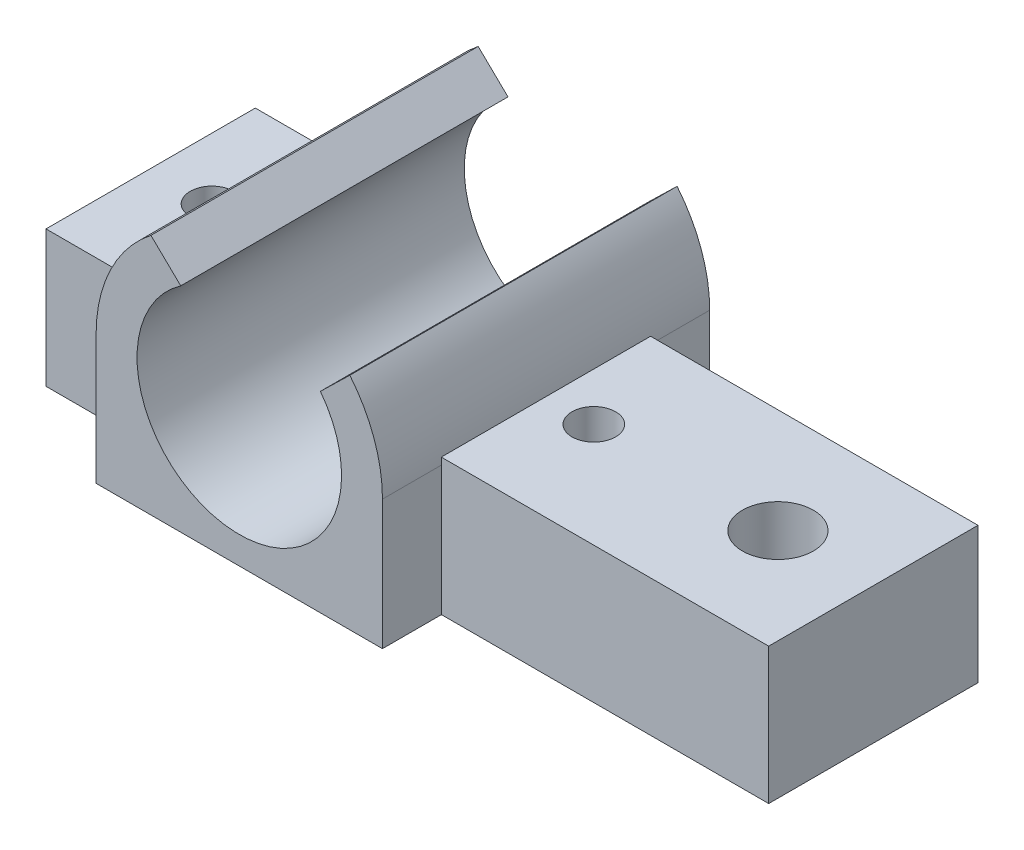
ISO-10303-21;
HEADER;
FILE_DESCRIPTION(('STEP AP214'),'2;1');
FILE_NAME('part.step','',(''),(''),'','','');
FILE_SCHEMA(('AUTOMOTIVE_DESIGN { 1 0 10303 214 1 1 1 1 }'));
ENDSEC;
DATA;
#1=APPLICATION_CONTEXT('core data for automotive mechanical design processes');
#2=APPLICATION_PROTOCOL_DEFINITION('international standard','automotive_design',2000,#1);
#3=PRODUCT_CONTEXT('',#1,'mechanical');
#4=PRODUCT('Part','Part','',(#3));
#5=PRODUCT_RELATED_PRODUCT_CATEGORY('part','',(#4));
#6=PRODUCT_DEFINITION_FORMATION('','',#4);
#7=PRODUCT_DEFINITION_CONTEXT('part definition',#1,'design');
#8=PRODUCT_DEFINITION('design','',#6,#7);
#9=PRODUCT_DEFINITION_SHAPE('','',#8);
#10=(LENGTH_UNIT() NAMED_UNIT(*) SI_UNIT(.MILLI.,.METRE.));
#11=(NAMED_UNIT(*) PLANE_ANGLE_UNIT() SI_UNIT($,.RADIAN.));
#12=(NAMED_UNIT(*) SI_UNIT($,.STERADIAN.) SOLID_ANGLE_UNIT());
#13=UNCERTAINTY_MEASURE_WITH_UNIT(LENGTH_MEASURE(1.E-05),#10,'distance_accuracy_value','');
#14=(GEOMETRIC_REPRESENTATION_CONTEXT(3) GLOBAL_UNCERTAINTY_ASSIGNED_CONTEXT((#13)) GLOBAL_UNIT_ASSIGNED_CONTEXT((#10,
#11,#12)) REPRESENTATION_CONTEXT('',''));
#15=CARTESIAN_POINT('',(0.,0.,0.));
#16=DIRECTION('',(0.,0.,1.));
#17=DIRECTION('',(1.,0.,0.));
#18=AXIS2_PLACEMENT_3D('',#15,#16,#17);
#19=CARTESIAN_POINT('',(66.3937346144684,10.,0.));
#20=DIRECTION('',(0.,-1.,0.));
#21=DIRECTION('',(0.,0.,-1.));
#22=AXIS2_PLACEMENT_3D('',#19,#20,#21);
#23=CYLINDRICAL_SURFACE('',#22,2.6);
#24=CARTESIAN_POINT('',(66.3937346144684,10.,0.));
#25=DIRECTION('',(0.,1.,0.));
#26=DIRECTION('',(0.,0.,1.));
#27=AXIS2_PLACEMENT_3D('',#24,#25,#26);
#28=CIRCLE('',#27,2.6);
#29=CARTESIAN_POINT('',(66.3937346144684,10.,2.6));
#30=VERTEX_POINT('',#29);
#31=EDGE_CURVE('E332',#30,#30,#28,.T.);
#32=ORIENTED_EDGE('',*,*,#31,.T.);
#33=EDGE_LOOP('',(#32));
#34=FACE_BOUND('',#33,.T.);
#35=CARTESIAN_POINT('',(66.3937346144684,4.4,0.));
#36=DIRECTION('',(0.,-1.,0.));
#37=DIRECTION('',(0.,0.,-1.));
#38=AXIS2_PLACEMENT_3D('',#35,#36,#37);
#39=CIRCLE('',#38,2.6);
#40=CARTESIAN_POINT('',(66.3937346144684,4.4,-2.6));
#41=VERTEX_POINT('',#40);
#42=EDGE_CURVE('E223',#41,#41,#39,.T.);
#43=ORIENTED_EDGE('',*,*,#42,.T.);
#44=EDGE_LOOP('',(#43));
#45=FACE_BOUND('',#44,.T.);
#46=ADVANCED_FACE('F35',(#34,#45),#23,.F.);
#47=CARTESIAN_POINT('',(0.,10.,0.));
#48=DIRECTION('',(0.,1.,0.));
#49=DIRECTION('',(0.,0.,1.));
#50=AXIS2_PLACEMENT_3D('',#47,#48,#49);
#51=PLANE('',#50);
#52=DIRECTION('',(0.,0.,-1.));
#53=VECTOR('',#52,1.);
#54=CARTESIAN_POINT('',(49.3818230961699,10.,43.8288287251762));
#55=LINE('',#54,#53);
#56=CARTESIAN_POINT('',(49.3818230961699,10.,7.675));
#57=VERTEX_POINT('',#56);
#58=CARTESIAN_POINT('',(49.3818230961699,10.,-7.675));
#59=VERTEX_POINT('',#58);
#60=EDGE_CURVE('E322',#57,#59,#55,.T.);
#61=ORIENTED_EDGE('',*,*,#60,.F.);
#62=DIRECTION('',(1.,0.,0.));
#63=VECTOR('',#62,1.);
#64=CARTESIAN_POINT('',(73.3937346144684,10.,7.675));
#65=LINE('',#64,#63);
#66=CARTESIAN_POINT('',(73.3937346144684,10.,7.675));
#67=VERTEX_POINT('',#66);
#68=EDGE_CURVE('E351',#57,#67,#65,.T.);
#69=ORIENTED_EDGE('',*,*,#68,.T.);
#70=DIRECTION('',(0.,0.,-1.));
#71=VECTOR('',#70,1.);
#72=CARTESIAN_POINT('',(73.3937346144684,10.,-7.675));
#73=LINE('',#72,#71);
#74=CARTESIAN_POINT('',(73.3937346144684,10.,-7.675));
#75=VERTEX_POINT('',#74);
#76=EDGE_CURVE('E356',#67,#75,#73,.T.);
#77=ORIENTED_EDGE('',*,*,#76,.T.);
#78=DIRECTION('',(-1.,0.,0.));
#79=VECTOR('',#78,1.);
#80=CARTESIAN_POINT('',(73.3937346144684,10.,-7.675));
#81=LINE('',#80,#79);
#82=EDGE_CURVE('E359',#75,#59,#81,.T.);
#83=ORIENTED_EDGE('',*,*,#82,.T.);
#84=EDGE_LOOP('',(#61,#69,#77,#83));
#85=FACE_BOUND('',#84,.T.);
#86=CARTESIAN_POINT('',(52.8937346144684,10.,0.));
#87=DIRECTION('',(0.,1.,0.));
#88=DIRECTION('',(0.,0.,1.));
#89=AXIS2_PLACEMENT_3D('',#86,#87,#88);
#90=CIRCLE('',#89,1.6);
#91=CARTESIAN_POINT('',(52.8937346144684,10.,1.6));
#92=VERTEX_POINT('',#91);
#93=EDGE_CURVE('E342',#92,#92,#90,.T.);
#94=ORIENTED_EDGE('',*,*,#93,.F.);
#95=EDGE_LOOP('',(#94));
#96=FACE_BOUND('',#95,.T.);
#97=ORIENTED_EDGE('',*,*,#31,.F.);
#98=EDGE_LOOP('',(#97));
#99=FACE_BOUND('',#98,.T.);
#100=ADVANCED_FACE('F397',(#85,#96,#99),#51,.T.);
#101=CARTESIAN_POINT('',(73.3937346144684,10.,7.675));
#102=DIRECTION('',(0.,0.,-1.));
#103=DIRECTION('',(-1.,0.,0.));
#104=AXIS2_PLACEMENT_3D('',#101,#102,#103);
#105=PLANE('',#104);
#106=DIRECTION('',(0.,-1.,0.));
#107=VECTOR('',#106,1.);
#108=CARTESIAN_POINT('',(28.3937346144684,10.,7.675));
#109=LINE('',#108,#107);
#110=CARTESIAN_POINT('',(28.3937346144684,9.5,7.67500000000001));
#111=VERTEX_POINT('',#110);
#112=CARTESIAN_POINT('',(28.3937346144684,0.,7.675));
#113=VERTEX_POINT('',#112);
#114=EDGE_CURVE('E330',#111,#113,#109,.T.);
#115=ORIENTED_EDGE('',*,*,#114,.F.);
#116=CARTESIAN_POINT('',(38.8937346144684,9.5,7.67500000000001));
#117=DIRECTION('',(0.,0.,-1.));
#118=DIRECTION('',(-1.,0.,0.));
#119=AXIS2_PLACEMENT_3D('',#116,#117,#118);
#120=CIRCLE('',#119,10.5);
#121=CARTESIAN_POINT('',(28.4056461327669,10.,7.675));
#122=VERTEX_POINT('',#121);
#123=EDGE_CURVE('E319',#111,#122,#120,.T.);
#124=ORIENTED_EDGE('',*,*,#123,.T.);
#125=CARTESIAN_POINT('',(20.3937346144684,10.,7.67500000000001));
#126=VERTEX_POINT('',#125);
#127=EDGE_CURVE('E353',#126,#122,#65,.T.);
#128=ORIENTED_EDGE('',*,*,#127,.F.);
#129=DIRECTION('',(0.,-1.,0.));
#130=VECTOR('',#129,1.);
#131=CARTESIAN_POINT('',(20.3937346144684,10.,7.67500000000001));
#132=LINE('',#131,#130);
#133=CARTESIAN_POINT('',(20.3937346144684,0.,7.67500000000001));
#134=VERTEX_POINT('',#133);
#135=EDGE_CURVE('E382',#126,#134,#132,.T.);
#136=ORIENTED_EDGE('',*,*,#135,.T.);
#137=DIRECTION('',(1.,0.,0.));
#138=VECTOR('',#137,1.);
#139=CARTESIAN_POINT('',(73.3937346144684,0.,7.675));
#140=LINE('',#139,#138);
#141=EDGE_CURVE('E366',#134,#113,#140,.T.);
#142=ORIENTED_EDGE('',*,*,#141,.T.);
#143=EDGE_LOOP('',(#115,#124,#128,#136,#142));
#144=FACE_BOUND('',#143,.T.);
#145=ADVANCED_FACE('F450',(#144),#105,.F.);
#146=CARTESIAN_POINT('',(73.3937346144684,10.,-7.675));
#147=DIRECTION('',(0.,0.,1.));
#148=DIRECTION('',(1.,0.,0.));
#149=AXIS2_PLACEMENT_3D('',#146,#147,#148);
#150=PLANE('',#149);
#151=DIRECTION('',(0.,1.,0.));
#152=VECTOR('',#151,1.);
#153=CARTESIAN_POINT('',(28.3937346144684,10.,-7.675));
#154=LINE('',#153,#152);
#155=CARTESIAN_POINT('',(28.3937346144684,0.,-7.67499999999999));
#156=VERTEX_POINT('',#155);
#157=CARTESIAN_POINT('',(28.3937346144684,9.5,-7.67499999999999));
#158=VERTEX_POINT('',#157);
#159=EDGE_CURVE('E388',#156,#158,#154,.T.);
#160=ORIENTED_EDGE('',*,*,#159,.F.);
#161=DIRECTION('',(-1.,0.,0.));
#162=VECTOR('',#161,1.);
#163=CARTESIAN_POINT('',(73.3937346144684,0.,-7.675));
#164=LINE('',#163,#162);
#165=CARTESIAN_POINT('',(20.3937346144684,0.,-7.67499999999999));
#166=VERTEX_POINT('',#165);
#167=EDGE_CURVE('E371',#156,#166,#164,.T.);
#168=ORIENTED_EDGE('',*,*,#167,.T.);
#169=DIRECTION('',(0.,-1.,0.));
#170=VECTOR('',#169,1.);
#171=CARTESIAN_POINT('',(20.3937346144684,10.,-7.67499999999999));
#172=LINE('',#171,#170);
#173=CARTESIAN_POINT('',(20.3937346144684,10.,-7.67499999999999));
#174=VERTEX_POINT('',#173);
#175=EDGE_CURVE('E362',#174,#166,#172,.T.);
#176=ORIENTED_EDGE('',*,*,#175,.F.);
#177=CARTESIAN_POINT('',(28.4056461327668,10.,-7.67499999999999));
#178=VERTEX_POINT('',#177);
#179=EDGE_CURVE('E358',#178,#174,#81,.T.);
#180=ORIENTED_EDGE('',*,*,#179,.F.);
#181=CARTESIAN_POINT('',(38.8937346144684,9.5,-7.67499999999999));
#182=DIRECTION('',(0.,0.,1.));
#183=DIRECTION('',(1.,0.,0.));
#184=AXIS2_PLACEMENT_3D('',#181,#182,#183);
#185=CIRCLE('',#184,10.5);
#186=EDGE_CURVE('E385',#178,#158,#185,.T.);
#187=ORIENTED_EDGE('',*,*,#186,.T.);
#188=EDGE_LOOP('',(#160,#168,#176,#180,#187));
#189=FACE_BOUND('',#188,.T.);
#190=ADVANCED_FACE('F458',(#189),#150,.F.);
#191=DIRECTION('',(0.,0.,-1.));
#192=VECTOR('',#191,1.);
#193=CARTESIAN_POINT('',(28.4056461327669,10.,43.8288287251762));
#194=LINE('',#193,#192);
#195=EDGE_CURVE('E317',#178,#122,#194,.F.);
#196=ORIENTED_EDGE('',*,*,#195,.F.);
#197=ORIENTED_EDGE('',*,*,#179,.T.);
#198=DIRECTION('',(0.,0.,1.));
#199=VECTOR('',#198,1.);
#200=CARTESIAN_POINT('',(20.3937346144684,10.,7.67500000000001));
#201=LINE('',#200,#199);
#202=EDGE_CURVE('E348',#174,#126,#201,.T.);
#203=ORIENTED_EDGE('',*,*,#202,.T.);
#204=ORIENTED_EDGE('',*,*,#127,.T.);
#205=EDGE_LOOP('',(#196,#197,#203,#204));
#206=FACE_BOUND('',#205,.T.);
#207=CARTESIAN_POINT('',(24.8937346144684,10.,0.));
#208=DIRECTION('',(0.,1.,0.));
#209=DIRECTION('',(0.,0.,1.));
#210=AXIS2_PLACEMENT_3D('',#207,#208,#209);
#211=CIRCLE('',#210,1.6);
#212=CARTESIAN_POINT('',(24.8937346144684,10.,1.6));
#213=VERTEX_POINT('',#212);
#214=EDGE_CURVE('E336',#213,#213,#211,.T.);
#215=ORIENTED_EDGE('',*,*,#214,.F.);
#216=EDGE_LOOP('',(#215));
#217=FACE_BOUND('',#216,.T.);
#218=ADVANCED_FACE('F479',(#206,#217),#51,.T.);
#219=CARTESIAN_POINT('',(0.,0.,0.));
#220=DIRECTION('',(0.,1.,0.));
#221=DIRECTION('',(0.,0.,1.));
#222=AXIS2_PLACEMENT_3D('',#219,#220,#221);
#223=PLANE('',#222);
#224=DIRECTION('',(0.,0.,-1.));
#225=VECTOR('',#224,1.);
#226=CARTESIAN_POINT('',(62.4100177570599,0.,2.3));
#227=LINE('',#226,#225);
#228=CARTESIAN_POINT('',(62.4100177570599,0.,2.3));
#229=VERTEX_POINT('',#228);
#230=CARTESIAN_POINT('',(62.4100177570599,0.,-2.3));
#231=VERTEX_POINT('',#230);
#232=EDGE_CURVE('E233',#229,#231,#227,.T.);
#233=ORIENTED_EDGE('',*,*,#232,.F.);
#234=DIRECTION('',(-0.866025403784438,0.,-0.5));
#235=VECTOR('',#234,1.);
#236=CARTESIAN_POINT('',(66.3937346144684,0.,4.6));
#237=LINE('',#236,#235);
#238=CARTESIAN_POINT('',(66.3937346144684,0.,4.6));
#239=VERTEX_POINT('',#238);
#240=EDGE_CURVE('E50',#239,#229,#237,.T.);
#241=ORIENTED_EDGE('',*,*,#240,.F.);
#242=DIRECTION('',(-0.866025403784439,0.,0.5));
#243=VECTOR('',#242,1.);
#244=CARTESIAN_POINT('',(70.3774514718768,0.,2.29999999999999));
#245=LINE('',#244,#243);
#246=CARTESIAN_POINT('',(70.3774514718768,0.,2.29999999999999));
#247=VERTEX_POINT('',#246);
#248=EDGE_CURVE('E217',#247,#239,#245,.T.);
#249=ORIENTED_EDGE('',*,*,#248,.F.);
#250=DIRECTION('',(0.,0.,1.));
#251=VECTOR('',#250,1.);
#252=CARTESIAN_POINT('',(70.3774514718768,0.,-2.3));
#253=LINE('',#252,#251);
#254=CARTESIAN_POINT('',(70.3774514718768,0.,-2.3));
#255=VERTEX_POINT('',#254);
#256=EDGE_CURVE('E220',#255,#247,#253,.T.);
#257=ORIENTED_EDGE('',*,*,#256,.F.);
#258=DIRECTION('',(0.866025403784439,0.,0.5));
#259=VECTOR('',#258,1.);
#260=CARTESIAN_POINT('',(66.3937346144684,0.,-4.60000000000001));
#261=LINE('',#260,#259);
#262=CARTESIAN_POINT('',(66.3937346144684,0.,-4.60000000000001));
#263=VERTEX_POINT('',#262);
#264=EDGE_CURVE('E238',#263,#255,#261,.T.);
#265=ORIENTED_EDGE('',*,*,#264,.F.);
#266=DIRECTION('',(0.866025403784439,0.,-0.5));
#267=VECTOR('',#266,1.);
#268=CARTESIAN_POINT('',(62.4100177570599,0.,-2.3));
#269=LINE('',#268,#267);
#270=EDGE_CURVE('E235',#231,#263,#269,.T.);
#271=ORIENTED_EDGE('',*,*,#270,.F.);
#272=EDGE_LOOP('',(#233,#241,#249,#257,#265,#271));
#273=FACE_BOUND('',#272,.T.);
#274=CARTESIAN_POINT('',(49.3937346144684,0.,7.675));
#275=VERTEX_POINT('',#274);
#276=CARTESIAN_POINT('',(73.3937346144684,0.,7.675));
#277=VERTEX_POINT('',#276);
#278=EDGE_CURVE('E365',#275,#277,#140,.T.);
#279=ORIENTED_EDGE('',*,*,#278,.F.);
#280=DIRECTION('',(0.,0.,-1.));
#281=VECTOR('',#280,1.);
#282=CARTESIAN_POINT('',(49.3937346144684,0.,43.8288287251762));
#283=LINE('',#282,#281);
#284=CARTESIAN_POINT('',(49.3937346144684,0.,12.));
#285=VERTEX_POINT('',#284);
#286=EDGE_CURVE('E311',#285,#275,#283,.T.);
#287=ORIENTED_EDGE('',*,*,#286,.F.);
#288=DIRECTION('',(1.,0.,0.));
#289=VECTOR('',#288,1.);
#290=CARTESIAN_POINT('',(49.3937346144684,0.,12.));
#291=LINE('',#290,#289);
#292=CARTESIAN_POINT('',(28.3937346144684,0.,12.));
#293=VERTEX_POINT('',#292);
#294=EDGE_CURVE('E288',#293,#285,#291,.T.);
#295=ORIENTED_EDGE('',*,*,#294,.F.);
#296=DIRECTION('',(0.,0.,-1.));
#297=VECTOR('',#296,1.);
#298=CARTESIAN_POINT('',(28.3937346144684,0.,43.8288287251762));
#299=LINE('',#298,#297);
#300=EDGE_CURVE('E279',#293,#113,#299,.T.);
#301=ORIENTED_EDGE('',*,*,#300,.T.);
#302=ORIENTED_EDGE('',*,*,#141,.F.);
#303=DIRECTION('',(0.,0.,1.));
#304=VECTOR('',#303,1.);
#305=CARTESIAN_POINT('',(20.3937346144684,0.,7.67500000000001));
#306=LINE('',#305,#304);
#307=EDGE_CURVE('E345',#166,#134,#306,.T.);
#308=ORIENTED_EDGE('',*,*,#307,.F.);
#309=ORIENTED_EDGE('',*,*,#167,.F.);
#310=CARTESIAN_POINT('',(28.3937346144684,0.,-12.));
#311=VERTEX_POINT('',#310);
#312=EDGE_CURVE('E313',#156,#311,#299,.T.);
#313=ORIENTED_EDGE('',*,*,#312,.T.);
#314=DIRECTION('',(-1.,0.,0.));
#315=VECTOR('',#314,1.);
#316=CARTESIAN_POINT('',(49.3937346144684,0.,-12.));
#317=LINE('',#316,#315);
#318=CARTESIAN_POINT('',(49.3937346144684,0.,-12.));
#319=VERTEX_POINT('',#318);
#320=EDGE_CURVE('E255',#319,#311,#317,.T.);
#321=ORIENTED_EDGE('',*,*,#320,.F.);
#322=CARTESIAN_POINT('',(49.3937346144684,0.,-7.675));
#323=VERTEX_POINT('',#322);
#324=EDGE_CURVE('E310',#323,#319,#283,.T.);
#325=ORIENTED_EDGE('',*,*,#324,.F.);
#326=CARTESIAN_POINT('',(73.3937346144684,0.,-7.675));
#327=VERTEX_POINT('',#326);
#328=EDGE_CURVE('E352',#327,#323,#164,.T.);
#329=ORIENTED_EDGE('',*,*,#328,.F.);
#330=DIRECTION('',(0.,0.,-1.));
#331=VECTOR('',#330,1.);
#332=CARTESIAN_POINT('',(73.3937346144684,0.,-7.675));
#333=LINE('',#332,#331);
#334=EDGE_CURVE('E369',#277,#327,#333,.T.);
#335=ORIENTED_EDGE('',*,*,#334,.F.);
#336=EDGE_LOOP('',(#279,#287,#295,#301,#302,#308,#309,#313,#321,#325,#329,#335));
#337=FACE_BOUND('',#336,.T.);
#338=CARTESIAN_POINT('',(52.8937346144684,0.,0.));
#339=DIRECTION('',(0.,1.,0.));
#340=DIRECTION('',(0.,0.,1.));
#341=AXIS2_PLACEMENT_3D('',#338,#339,#340);
#342=CIRCLE('',#341,1.6);
#343=CARTESIAN_POINT('',(52.8937346144684,0.,1.6));
#344=VERTEX_POINT('',#343);
#345=EDGE_CURVE('E339',#344,#344,#342,.T.);
#346=ORIENTED_EDGE('',*,*,#345,.T.);
#347=EDGE_LOOP('',(#346));
#348=FACE_BOUND('',#347,.T.);
#349=CARTESIAN_POINT('',(24.8937346144684,0.,0.));
#350=DIRECTION('',(0.,1.,0.));
#351=DIRECTION('',(0.,0.,1.));
#352=AXIS2_PLACEMENT_3D('',#349,#350,#351);
#353=CIRCLE('',#352,1.6);
#354=CARTESIAN_POINT('',(24.8937346144684,0.,1.6));
#355=VERTEX_POINT('',#354);
#356=EDGE_CURVE('E335',#355,#355,#353,.T.);
#357=ORIENTED_EDGE('',*,*,#356,.T.);
#358=EDGE_LOOP('',(#357));
#359=FACE_BOUND('',#358,.T.);
#360=ADVANCED_FACE('F410',(#273,#337,#348,#359),#223,.F.);
#361=CARTESIAN_POINT('',(20.3937346144684,10.,7.67500000000001));
#362=DIRECTION('',(1.,0.,0.));
#363=DIRECTION('',(0.,0.,-1.));
#364=AXIS2_PLACEMENT_3D('',#361,#362,#363);
#365=PLANE('',#364);
#366=ORIENTED_EDGE('',*,*,#307,.T.);
#367=ORIENTED_EDGE('',*,*,#135,.F.);
#368=ORIENTED_EDGE('',*,*,#202,.F.);
#369=ORIENTED_EDGE('',*,*,#175,.T.);
#370=EDGE_LOOP('',(#366,#367,#368,#369));
#371=FACE_BOUND('',#370,.T.);
#372=ADVANCED_FACE('F37',(#371),#365,.F.);
#373=CARTESIAN_POINT('',(38.8937346144684,9.5,7.67500000000001));
#374=DIRECTION('',(0.,0.,-1.));
#375=DIRECTION('',(-1.,0.,0.));
#376=AXIS2_PLACEMENT_3D('',#373,#374,#375);
#377=CIRCLE('',#376,10.5);
#378=CARTESIAN_POINT('',(49.3937346144684,9.5,7.67500000000001));
#379=VERTEX_POINT('',#378);
#380=EDGE_CURVE('E324',#57,#379,#377,.T.);
#381=ORIENTED_EDGE('',*,*,#380,.T.);
#382=DIRECTION('',(0.,-1.,0.));
#383=VECTOR('',#382,1.);
#384=CARTESIAN_POINT('',(49.3937346144684,10.,7.675));
#385=LINE('',#384,#383);
#386=EDGE_CURVE('E327',#379,#275,#385,.T.);
#387=ORIENTED_EDGE('',*,*,#386,.T.);
#388=ORIENTED_EDGE('',*,*,#278,.T.);
#389=DIRECTION('',(0.,-1.,0.));
#390=VECTOR('',#389,1.);
#391=CARTESIAN_POINT('',(73.3937346144684,10.,7.675));
#392=LINE('',#391,#390);
#393=EDGE_CURVE('E379',#67,#277,#392,.T.);
#394=ORIENTED_EDGE('',*,*,#393,.F.);
#395=ORIENTED_EDGE('',*,*,#68,.F.);
#396=EDGE_LOOP('',(#381,#387,#388,#394,#395));
#397=FACE_BOUND('',#396,.T.);
#398=ADVANCED_FACE('F497',(#397),#105,.F.);
#399=CARTESIAN_POINT('',(73.3937346144684,10.,-7.675));
#400=DIRECTION('',(-1.,0.,0.));
#401=DIRECTION('',(0.,0.,1.));
#402=AXIS2_PLACEMENT_3D('',#399,#400,#401);
#403=PLANE('',#402);
#404=ORIENTED_EDGE('',*,*,#334,.T.);
#405=DIRECTION('',(0.,-1.,0.));
#406=VECTOR('',#405,1.);
#407=CARTESIAN_POINT('',(73.3937346144684,10.,-7.675));
#408=LINE('',#407,#406);
#409=EDGE_CURVE('E376',#75,#327,#408,.T.);
#410=ORIENTED_EDGE('',*,*,#409,.F.);
#411=ORIENTED_EDGE('',*,*,#76,.F.);
#412=ORIENTED_EDGE('',*,*,#393,.T.);
#413=EDGE_LOOP('',(#404,#410,#411,#412));
#414=FACE_BOUND('',#413,.T.);
#415=ADVANCED_FACE('F404',(#414),#403,.F.);
#416=ORIENTED_EDGE('',*,*,#328,.T.);
#417=DIRECTION('',(0.,1.,0.));
#418=VECTOR('',#417,1.);
#419=CARTESIAN_POINT('',(49.3937346144684,10.,-7.675));
#420=LINE('',#419,#418);
#421=CARTESIAN_POINT('',(49.3937346144684,9.5,-7.67499999999999));
#422=VERTEX_POINT('',#421);
#423=EDGE_CURVE('E12',#323,#422,#420,.T.);
#424=ORIENTED_EDGE('',*,*,#423,.T.);
#425=CARTESIAN_POINT('',(38.8937346144684,9.5,-7.67499999999999));
#426=DIRECTION('',(0.,0.,1.));
#427=DIRECTION('',(1.,0.,0.));
#428=AXIS2_PLACEMENT_3D('',#425,#426,#427);
#429=CIRCLE('',#428,10.5);
#430=EDGE_CURVE('E43',#422,#59,#429,.T.);
#431=ORIENTED_EDGE('',*,*,#430,.T.);
#432=ORIENTED_EDGE('',*,*,#82,.F.);
#433=ORIENTED_EDGE('',*,*,#409,.T.);
#434=EDGE_LOOP('',(#416,#424,#431,#432,#433));
#435=FACE_BOUND('',#434,.T.);
#436=ADVANCED_FACE('F392',(#435),#150,.F.);
#437=CARTESIAN_POINT('',(52.8937346144684,10.,0.));
#438=DIRECTION('',(0.,-1.,0.));
#439=DIRECTION('',(0.,0.,-1.));
#440=AXIS2_PLACEMENT_3D('',#437,#438,#439);
#441=CYLINDRICAL_SURFACE('',#440,1.6);
#442=ORIENTED_EDGE('',*,*,#93,.T.);
#443=EDGE_LOOP('',(#442));
#444=FACE_BOUND('',#443,.T.);
#445=ORIENTED_EDGE('',*,*,#345,.F.);
#446=EDGE_LOOP('',(#445));
#447=FACE_BOUND('',#446,.T.);
#448=ADVANCED_FACE('F484',(#444,#447),#441,.F.);
#449=CARTESIAN_POINT('',(24.8937346144684,10.,0.));
#450=DIRECTION('',(0.,-1.,0.));
#451=DIRECTION('',(0.,0.,-1.));
#452=AXIS2_PLACEMENT_3D('',#449,#450,#451);
#453=CYLINDRICAL_SURFACE('',#452,1.6);
#454=ORIENTED_EDGE('',*,*,#214,.T.);
#455=EDGE_LOOP('',(#454));
#456=FACE_BOUND('',#455,.T.);
#457=ORIENTED_EDGE('',*,*,#356,.F.);
#458=EDGE_LOOP('',(#457));
#459=FACE_BOUND('',#458,.T.);
#460=ADVANCED_FACE('F471',(#456,#459),#453,.F.);
#461=CARTESIAN_POINT('',(28.3937346144684,9.5,43.8288287251762));
#462=DIRECTION('',(1.,0.,0.));
#463=DIRECTION('',(0.,0.,-1.));
#464=AXIS2_PLACEMENT_3D('',#461,#462,#463);
#465=PLANE('',#464);
#466=DIRECTION('',(0.,0.,-1.));
#467=VECTOR('',#466,1.);
#468=CARTESIAN_POINT('',(28.3937346144684,9.5,43.8288287251762));
#469=LINE('',#468,#467);
#470=CARTESIAN_POINT('',(28.3937346144684,9.5,12.));
#471=VERTEX_POINT('',#470);
#472=EDGE_CURVE('E294',#471,#111,#469,.T.);
#473=ORIENTED_EDGE('',*,*,#472,.T.);
#474=ORIENTED_EDGE('',*,*,#114,.T.);
#475=ORIENTED_EDGE('',*,*,#300,.F.);
#476=DIRECTION('',(0.,1.,0.));
#477=VECTOR('',#476,1.);
#478=CARTESIAN_POINT('',(28.3937346144684,9.5,12.));
#479=LINE('',#478,#477);
#480=EDGE_CURVE('E290',#293,#471,#479,.T.);
#481=ORIENTED_EDGE('',*,*,#480,.T.);
#482=EDGE_LOOP('',(#473,#474,#475,#481));
#483=FACE_BOUND('',#482,.T.);
#484=ADVANCED_FACE('F445',(#483),#465,.F.);
#485=ORIENTED_EDGE('',*,*,#312,.F.);
#486=ORIENTED_EDGE('',*,*,#159,.T.);
#487=CARTESIAN_POINT('',(28.3937346144684,9.5,-12.));
#488=VERTEX_POINT('',#487);
#489=EDGE_CURVE('E58',#158,#488,#469,.T.);
#490=ORIENTED_EDGE('',*,*,#489,.T.);
#491=DIRECTION('',(0.,-1.,0.));
#492=VECTOR('',#491,1.);
#493=CARTESIAN_POINT('',(28.3937346144684,9.5,-12.));
#494=LINE('',#493,#492);
#495=EDGE_CURVE('E245',#488,#311,#494,.T.);
#496=ORIENTED_EDGE('',*,*,#495,.T.);
#497=EDGE_LOOP('',(#485,#486,#490,#496));
#498=FACE_BOUND('',#497,.T.);
#499=ADVANCED_FACE('F461',(#498),#465,.F.);
#500=CARTESIAN_POINT('',(49.3937346144684,9.5,43.8288287251762));
#501=DIRECTION('',(1.,0.,0.));
#502=DIRECTION('',(0.,0.,-1.));
#503=AXIS2_PLACEMENT_3D('',#500,#501,#502);
#504=PLANE('',#503);
#505=ORIENTED_EDGE('',*,*,#386,.F.);
#506=DIRECTION('',(0.,0.,-1.));
#507=VECTOR('',#506,1.);
#508=CARTESIAN_POINT('',(49.3937346144684,9.5,43.8288287251762));
#509=LINE('',#508,#507);
#510=CARTESIAN_POINT('',(49.3937346144684,9.5,12.));
#511=VERTEX_POINT('',#510);
#512=EDGE_CURVE('E307',#511,#379,#509,.T.);
#513=ORIENTED_EDGE('',*,*,#512,.F.);
#514=DIRECTION('',(0.,1.,0.));
#515=VECTOR('',#514,1.);
#516=CARTESIAN_POINT('',(49.3937346144684,9.5,12.));
#517=LINE('',#516,#515);
#518=EDGE_CURVE('E286',#285,#511,#517,.T.);
#519=ORIENTED_EDGE('',*,*,#518,.F.);
#520=ORIENTED_EDGE('',*,*,#286,.T.);
#521=EDGE_LOOP('',(#505,#513,#519,#520));
#522=FACE_BOUND('',#521,.T.);
#523=ADVANCED_FACE('F463',(#522),#504,.T.);
#524=ORIENTED_EDGE('',*,*,#423,.F.);
#525=ORIENTED_EDGE('',*,*,#324,.T.);
#526=DIRECTION('',(0.,-1.,0.));
#527=VECTOR('',#526,1.);
#528=CARTESIAN_POINT('',(49.3937346144684,9.5,-12.));
#529=LINE('',#528,#527);
#530=CARTESIAN_POINT('',(49.3937346144684,9.5,-12.));
#531=VERTEX_POINT('',#530);
#532=EDGE_CURVE('E258',#531,#319,#529,.T.);
#533=ORIENTED_EDGE('',*,*,#532,.F.);
#534=EDGE_CURVE('E306',#422,#531,#509,.T.);
#535=ORIENTED_EDGE('',*,*,#534,.F.);
#536=EDGE_LOOP('',(#524,#525,#533,#535));
#537=FACE_BOUND('',#536,.T.);
#538=ADVANCED_FACE('F415',(#537),#504,.T.);
#539=CARTESIAN_POINT('',(38.8937346144684,9.5,43.8288287251762));
#540=DIRECTION('',(0.,0.,-1.));
#541=DIRECTION('',(-1.,0.,0.));
#542=AXIS2_PLACEMENT_3D('',#539,#540,#541);
#543=CYLINDRICAL_SURFACE('',#542,10.5);
#544=ORIENTED_EDGE('',*,*,#380,.F.);
#545=ORIENTED_EDGE('',*,*,#60,.T.);
#546=ORIENTED_EDGE('',*,*,#430,.F.);
#547=ORIENTED_EDGE('',*,*,#534,.T.);
#548=CARTESIAN_POINT('',(38.8937346144684,9.5,-12.));
#549=DIRECTION('',(0.,0.,-1.));
#550=DIRECTION('',(-1.,0.,0.));
#551=AXIS2_PLACEMENT_3D('',#548,#549,#550);
#552=CIRCLE('',#551,10.5);
#553=CARTESIAN_POINT('',(47.0022725648829,16.170952878464,-12.));
#554=VERTEX_POINT('',#553);
#555=EDGE_CURVE('E261',#554,#531,#552,.T.);
#556=ORIENTED_EDGE('',*,*,#555,.F.);
#557=DIRECTION('',(0.,0.,-1.));
#558=VECTOR('',#557,1.);
#559=CARTESIAN_POINT('',(47.002272564883,16.170952878464,43.8288287251762));
#560=LINE('',#559,#558);
#561=CARTESIAN_POINT('',(47.002272564883,16.170952878464,12.));
#562=VERTEX_POINT('',#561);
#563=EDGE_CURVE('E304',#562,#554,#560,.T.);
#564=ORIENTED_EDGE('',*,*,#563,.F.);
#565=CARTESIAN_POINT('',(38.8937346144684,9.5,12.));
#566=DIRECTION('',(0.,0.,-1.));
#567=DIRECTION('',(-1.,0.,0.));
#568=AXIS2_PLACEMENT_3D('',#565,#566,#567);
#569=CIRCLE('',#568,10.5);
#570=EDGE_CURVE('E284',#511,#562,#569,.F.);
#571=ORIENTED_EDGE('',*,*,#570,.F.);
#572=ORIENTED_EDGE('',*,*,#512,.T.);
#573=EDGE_LOOP('',(#544,#545,#546,#547,#556,#564,#571,#572));
#574=FACE_BOUND('',#573,.T.);
#575=ADVANCED_FACE('F423',(#574),#543,.T.);
#576=CARTESIAN_POINT('',(38.8937346144684,9.5,43.8288287251762));
#577=DIRECTION('',(0.,0.,-1.));
#578=DIRECTION('',(-1.,0.,0.));
#579=AXIS2_PLACEMENT_3D('',#576,#577,#578);
#580=CYLINDRICAL_SURFACE('',#579,7.5);
#581=CARTESIAN_POINT('',(38.8937346144684,9.5,-12.));
#582=DIRECTION('',(0.,0.,-1.));
#583=DIRECTION('',(-1.,0.,0.));
#584=AXIS2_PLACEMENT_3D('',#581,#582,#583);
#585=CIRCLE('',#584,7.5);
#586=CARTESIAN_POINT('',(44.8412989910687,14.0690784613743,-12.));
#587=VERTEX_POINT('',#586);
#588=CARTESIAN_POINT('',(34.5997810657253,15.6491432672558,-12.));
#589=VERTEX_POINT('',#588);
#590=EDGE_CURVE('E267',#587,#589,#585,.T.);
#591=ORIENTED_EDGE('',*,*,#590,.T.);
#592=DIRECTION('',(0.,0.,-1.));
#593=VECTOR('',#592,1.);
#594=CARTESIAN_POINT('',(34.5997810657253,15.6491432672558,43.8288287251762));
#595=LINE('',#594,#593);
#596=CARTESIAN_POINT('',(34.5997810657253,15.6491432672558,12.));
#597=VERTEX_POINT('',#596);
#598=EDGE_CURVE('E299',#597,#589,#595,.T.);
#599=ORIENTED_EDGE('',*,*,#598,.F.);
#600=CARTESIAN_POINT('',(38.8937346144684,9.5,12.));
#601=DIRECTION('',(0.,0.,-1.));
#602=DIRECTION('',(-1.,0.,0.));
#603=AXIS2_PLACEMENT_3D('',#600,#601,#602);
#604=CIRCLE('',#603,7.5);
#605=CARTESIAN_POINT('',(44.8412989910687,14.0690784613742,12.));
#606=VERTEX_POINT('',#605);
#607=EDGE_CURVE('E278',#597,#606,#604,.F.);
#608=ORIENTED_EDGE('',*,*,#607,.T.);
#609=DIRECTION('',(0.,0.,-1.));
#610=VECTOR('',#609,1.);
#611=CARTESIAN_POINT('',(44.8412989910688,14.0690784613743,43.8288287251762));
#612=LINE('',#611,#610);
#613=EDGE_CURVE('E302',#606,#587,#612,.T.);
#614=ORIENTED_EDGE('',*,*,#613,.T.);
#615=EDGE_LOOP('',(#591,#599,#608,#614));
#616=FACE_BOUND('',#615,.T.);
#617=ADVANCED_FACE('F434',(#616),#580,.F.);
#618=CARTESIAN_POINT('',(38.8937346144684,9.5,43.8288287251762));
#619=DIRECTION('',(0.,0.,-1.));
#620=DIRECTION('',(-1.,0.,0.));
#621=AXIS2_PLACEMENT_3D('',#618,#619,#620);
#622=CYLINDRICAL_SURFACE('',#621,10.5);
#623=ORIENTED_EDGE('',*,*,#123,.F.);
#624=ORIENTED_EDGE('',*,*,#472,.F.);
#625=CARTESIAN_POINT('',(38.8937346144684,9.5,12.));
#626=DIRECTION('',(0.,0.,-1.));
#627=DIRECTION('',(-1.,0.,0.));
#628=AXIS2_PLACEMENT_3D('',#625,#626,#627);
#629=CIRCLE('',#628,10.5);
#630=CARTESIAN_POINT('',(32.4128085324897,17.7612103907314,12.));
#631=VERTEX_POINT('',#630);
#632=EDGE_CURVE('E293',#631,#471,#629,.F.);
#633=ORIENTED_EDGE('',*,*,#632,.F.);
#634=DIRECTION('',(0.,0.,-1.));
#635=VECTOR('',#634,1.);
#636=CARTESIAN_POINT('',(32.4128085324897,17.7612103907314,43.8288287251762));
#637=LINE('',#636,#635);
#638=CARTESIAN_POINT('',(32.4128085324897,17.7612103907314,-12.));
#639=VERTEX_POINT('',#638);
#640=EDGE_CURVE('E297',#631,#639,#637,.T.);
#641=ORIENTED_EDGE('',*,*,#640,.T.);
#642=CARTESIAN_POINT('',(38.8937346144684,9.5,-12.));
#643=DIRECTION('',(0.,0.,-1.));
#644=DIRECTION('',(-1.,0.,0.));
#645=AXIS2_PLACEMENT_3D('',#642,#643,#644);
#646=CIRCLE('',#645,10.5);
#647=EDGE_CURVE('E272',#488,#639,#646,.T.);
#648=ORIENTED_EDGE('',*,*,#647,.F.);
#649=ORIENTED_EDGE('',*,*,#489,.F.);
#650=ORIENTED_EDGE('',*,*,#186,.F.);
#651=ORIENTED_EDGE('',*,*,#195,.T.);
#652=EDGE_LOOP('',(#623,#624,#633,#641,#648,#649,#650,#651));
#653=FACE_BOUND('',#652,.T.);
#654=ADVANCED_FACE('F439',(#653),#622,.T.);
#655=CARTESIAN_POINT('',(44.8412989910688,14.0690784613743,43.8288287251762));
#656=DIRECTION('',(-0.697236610627753,0.71684106244015,0.));
#657=DIRECTION('',(-0.71684106244015,-0.697236610627753,0.));
#658=AXIS2_PLACEMENT_3D('',#655,#656,#657);
#659=PLANE('',#658);
#660=DIRECTION('',(-0.71684106244015,-0.697236610627753,0.));
#661=VECTOR('',#660,1.);
#662=CARTESIAN_POINT('',(44.8412989910687,14.0690784613743,12.));
#663=LINE('',#662,#661);
#664=EDGE_CURVE('E282',#562,#606,#663,.T.);
#665=ORIENTED_EDGE('',*,*,#664,.F.);
#666=ORIENTED_EDGE('',*,*,#563,.T.);
#667=DIRECTION('',(0.71684106244015,0.697236610627753,0.));
#668=VECTOR('',#667,1.);
#669=CARTESIAN_POINT('',(44.8412989910687,14.0690784613743,-12.));
#670=LINE('',#669,#668);
#671=EDGE_CURVE('E264',#587,#554,#670,.T.);
#672=ORIENTED_EDGE('',*,*,#671,.F.);
#673=ORIENTED_EDGE('',*,*,#613,.F.);
#674=EDGE_LOOP('',(#665,#666,#672,#673));
#675=FACE_BOUND('',#674,.T.);
#676=ADVANCED_FACE('F428',(#675),#659,.T.);
#677=CARTESIAN_POINT('',(34.5997810657253,15.6491432672558,43.8288287251762));
#678=DIRECTION('',(-0.694680886409839,-0.719318056256647,0.));
#679=DIRECTION('',(0.719318056256647,-0.694680886409839,0.));
#680=AXIS2_PLACEMENT_3D('',#677,#678,#679);
#681=PLANE('',#680);
#682=ORIENTED_EDGE('',*,*,#640,.F.);
#683=DIRECTION('',(0.719318056256647,-0.694680886409839,0.));
#684=VECTOR('',#683,1.);
#685=CARTESIAN_POINT('',(34.5997810657253,15.6491432672558,12.));
#686=LINE('',#685,#684);
#687=EDGE_CURVE('E275',#631,#597,#686,.T.);
#688=ORIENTED_EDGE('',*,*,#687,.T.);
#689=ORIENTED_EDGE('',*,*,#598,.T.);
#690=DIRECTION('',(-0.719318056256647,0.694680886409839,0.));
#691=VECTOR('',#690,1.);
#692=CARTESIAN_POINT('',(34.5997810657253,15.6491432672558,-12.));
#693=LINE('',#692,#691);
#694=EDGE_CURVE('E269',#589,#639,#693,.T.);
#695=ORIENTED_EDGE('',*,*,#694,.T.);
#696=EDGE_LOOP('',(#682,#688,#689,#695));
#697=FACE_BOUND('',#696,.T.);
#698=ADVANCED_FACE('F438',(#697),#681,.F.);
#699=CARTESIAN_POINT('',(73.3937346144684,10.,12.));
#700=DIRECTION('',(0.,0.,-1.));
#701=DIRECTION('',(-1.,0.,0.));
#702=AXIS2_PLACEMENT_3D('',#699,#700,#701);
#703=PLANE('',#702);
#704=ORIENTED_EDGE('',*,*,#294,.T.);
#705=ORIENTED_EDGE('',*,*,#518,.T.);
#706=ORIENTED_EDGE('',*,*,#570,.T.);
#707=ORIENTED_EDGE('',*,*,#664,.T.);
#708=ORIENTED_EDGE('',*,*,#607,.F.);
#709=ORIENTED_EDGE('',*,*,#687,.F.);
#710=ORIENTED_EDGE('',*,*,#632,.T.);
#711=ORIENTED_EDGE('',*,*,#480,.F.);
#712=EDGE_LOOP('',(#704,#705,#706,#707,#708,#709,#710,#711));
#713=FACE_BOUND('',#712,.T.);
#714=ADVANCED_FACE('F431',(#713),#703,.F.);
#715=CARTESIAN_POINT('',(38.8937346144684,9.5,-12.));
#716=DIRECTION('',(0.,0.,-1.));
#717=DIRECTION('',(-1.,0.,0.));
#718=AXIS2_PLACEMENT_3D('',#715,#716,#717);
#719=PLANE('',#718);
#720=ORIENTED_EDGE('',*,*,#495,.F.);
#721=ORIENTED_EDGE('',*,*,#647,.T.);
#722=ORIENTED_EDGE('',*,*,#694,.F.);
#723=ORIENTED_EDGE('',*,*,#590,.F.);
#724=ORIENTED_EDGE('',*,*,#671,.T.);
#725=ORIENTED_EDGE('',*,*,#555,.T.);
#726=ORIENTED_EDGE('',*,*,#532,.T.);
#727=ORIENTED_EDGE('',*,*,#320,.T.);
#728=EDGE_LOOP('',(#720,#721,#722,#723,#724,#725,#726,#727));
#729=FACE_BOUND('',#728,.T.);
#730=ADVANCED_FACE('F418',(#729),#719,.T.);
#731=CARTESIAN_POINT('',(66.3937346144684,4.,4.6));
#732=DIRECTION('',(-0.5,0.,0.866025403784438));
#733=DIRECTION('',(0.866025403784439,0.,0.5));
#734=AXIS2_PLACEMENT_3D('',#731,#732,#733);
#735=PLANE('',#734);
#736=ORIENTED_EDGE('',*,*,#240,.T.);
#737=DIRECTION('',(0.,-1.,0.));
#738=VECTOR('',#737,1.);
#739=CARTESIAN_POINT('',(62.4100177570599,4.,2.3));
#740=LINE('',#739,#738);
#741=CARTESIAN_POINT('',(62.4100177570599,4.,2.3));
#742=VERTEX_POINT('',#741);
#743=EDGE_CURVE('E194',#742,#229,#740,.T.);
#744=ORIENTED_EDGE('',*,*,#743,.F.);
#745=DIRECTION('',(-0.866025403784438,0.,-0.5));
#746=VECTOR('',#745,1.);
#747=CARTESIAN_POINT('',(66.3937346144684,4.,4.6));
#748=LINE('',#747,#746);
#749=CARTESIAN_POINT('',(66.3937346144684,4.,4.6));
#750=VERTEX_POINT('',#749);
#751=EDGE_CURVE('E198',#750,#742,#748,.T.);
#752=ORIENTED_EDGE('',*,*,#751,.F.);
#753=DIRECTION('',(0.,-1.,0.));
#754=VECTOR('',#753,1.);
#755=CARTESIAN_POINT('',(66.3937346144684,4.,4.6));
#756=LINE('',#755,#754);
#757=EDGE_CURVE('E243',#750,#239,#756,.T.);
#758=ORIENTED_EDGE('',*,*,#757,.T.);
#759=EDGE_LOOP('',(#736,#744,#752,#758));
#760=FACE_BOUND('',#759,.T.);
#761=ADVANCED_FACE('F196',(#760),#735,.F.);
#762=CARTESIAN_POINT('',(70.3774514718768,4.,2.29999999999999));
#763=DIRECTION('',(0.5,0.,0.866025403784439));
#764=DIRECTION('',(0.866025403784439,0.,-0.5));
#765=AXIS2_PLACEMENT_3D('',#762,#763,#764);
#766=PLANE('',#765);
#767=ORIENTED_EDGE('',*,*,#248,.T.);
#768=ORIENTED_EDGE('',*,*,#757,.F.);
#769=DIRECTION('',(-0.866025403784439,0.,0.5));
#770=VECTOR('',#769,1.);
#771=CARTESIAN_POINT('',(70.3774514718768,4.,2.29999999999999));
#772=LINE('',#771,#770);
#773=CARTESIAN_POINT('',(70.3774514718768,4.,2.29999999999999));
#774=VERTEX_POINT('',#773);
#775=EDGE_CURVE('E204',#774,#750,#772,.T.);
#776=ORIENTED_EDGE('',*,*,#775,.F.);
#777=DIRECTION('',(0.,-1.,0.));
#778=VECTOR('',#777,1.);
#779=CARTESIAN_POINT('',(70.3774514718768,4.,2.29999999999999));
#780=LINE('',#779,#778);
#781=EDGE_CURVE('E246',#774,#247,#780,.T.);
#782=ORIENTED_EDGE('',*,*,#781,.T.);
#783=EDGE_LOOP('',(#767,#768,#776,#782));
#784=FACE_BOUND('',#783,.T.);
#785=ADVANCED_FACE('F649',(#784),#766,.F.);
#786=CARTESIAN_POINT('',(70.3774514718768,4.,-2.3));
#787=DIRECTION('',(1.,0.,0.));
#788=DIRECTION('',(0.,0.,-1.));
#789=AXIS2_PLACEMENT_3D('',#786,#787,#788);
#790=PLANE('',#789);
#791=ORIENTED_EDGE('',*,*,#256,.T.);
#792=ORIENTED_EDGE('',*,*,#781,.F.);
#793=DIRECTION('',(0.,0.,1.));
#794=VECTOR('',#793,1.);
#795=CARTESIAN_POINT('',(70.3774514718768,4.,-2.3));
#796=LINE('',#795,#794);
#797=CARTESIAN_POINT('',(70.3774514718768,4.,-2.3));
#798=VERTEX_POINT('',#797);
#799=EDGE_CURVE('E229',#798,#774,#796,.T.);
#800=ORIENTED_EDGE('',*,*,#799,.F.);
#801=DIRECTION('',(0.,-1.,0.));
#802=VECTOR('',#801,1.);
#803=CARTESIAN_POINT('',(70.3774514718768,4.,-2.3));
#804=LINE('',#803,#802);
#805=EDGE_CURVE('E248',#798,#255,#804,.T.);
#806=ORIENTED_EDGE('',*,*,#805,.T.);
#807=EDGE_LOOP('',(#791,#792,#800,#806));
#808=FACE_BOUND('',#807,.T.);
#809=ADVANCED_FACE('F655',(#808),#790,.F.);
#810=CARTESIAN_POINT('',(66.3937346144684,4.,-4.60000000000001));
#811=DIRECTION('',(0.5,0.,-0.866025403784439));
#812=DIRECTION('',(-0.866025403784439,0.,-0.5));
#813=AXIS2_PLACEMENT_3D('',#810,#811,#812);
#814=PLANE('',#813);
#815=ORIENTED_EDGE('',*,*,#264,.T.);
#816=ORIENTED_EDGE('',*,*,#805,.F.);
#817=DIRECTION('',(0.866025403784439,0.,0.5));
#818=VECTOR('',#817,1.);
#819=CARTESIAN_POINT('',(66.3937346144684,4.,-4.60000000000001));
#820=LINE('',#819,#818);
#821=CARTESIAN_POINT('',(66.3937346144684,4.,-4.60000000000001));
#822=VERTEX_POINT('',#821);
#823=EDGE_CURVE('E226',#822,#798,#820,.T.);
#824=ORIENTED_EDGE('',*,*,#823,.F.);
#825=DIRECTION('',(0.,-1.,0.));
#826=VECTOR('',#825,1.);
#827=CARTESIAN_POINT('',(66.3937346144684,4.,-4.60000000000001));
#828=LINE('',#827,#826);
#829=EDGE_CURVE('E250',#822,#263,#828,.T.);
#830=ORIENTED_EDGE('',*,*,#829,.T.);
#831=EDGE_LOOP('',(#815,#816,#824,#830));
#832=FACE_BOUND('',#831,.T.);
#833=ADVANCED_FACE('F663',(#832),#814,.F.);
#834=CARTESIAN_POINT('',(62.4100177570599,4.,-2.3));
#835=DIRECTION('',(-0.499999999999999,0.,-0.866025403784439));
#836=DIRECTION('',(-0.866025403784439,0.,0.5));
#837=AXIS2_PLACEMENT_3D('',#834,#835,#836);
#838=PLANE('',#837);
#839=ORIENTED_EDGE('',*,*,#270,.T.);
#840=ORIENTED_EDGE('',*,*,#829,.F.);
#841=DIRECTION('',(0.866025403784439,0.,-0.5));
#842=VECTOR('',#841,1.);
#843=CARTESIAN_POINT('',(62.4100177570599,4.,-2.3));
#844=LINE('',#843,#842);
#845=CARTESIAN_POINT('',(62.4100177570599,4.,-2.3));
#846=VERTEX_POINT('',#845);
#847=EDGE_CURVE('E212',#846,#822,#844,.T.);
#848=ORIENTED_EDGE('',*,*,#847,.F.);
#849=DIRECTION('',(0.,-1.,0.));
#850=VECTOR('',#849,1.);
#851=CARTESIAN_POINT('',(62.4100177570599,4.,-2.3));
#852=LINE('',#851,#850);
#853=EDGE_CURVE('E203',#846,#231,#852,.T.);
#854=ORIENTED_EDGE('',*,*,#853,.T.);
#855=EDGE_LOOP('',(#839,#840,#848,#854));
#856=FACE_BOUND('',#855,.T.);
#857=ADVANCED_FACE('F671',(#856),#838,.F.);
#858=CARTESIAN_POINT('',(62.4100177570599,4.,2.3));
#859=DIRECTION('',(-1.,0.,0.));
#860=DIRECTION('',(0.,0.,1.));
#861=AXIS2_PLACEMENT_3D('',#858,#859,#860);
#862=PLANE('',#861);
#863=ORIENTED_EDGE('',*,*,#232,.T.);
#864=ORIENTED_EDGE('',*,*,#853,.F.);
#865=DIRECTION('',(0.,0.,-1.));
#866=VECTOR('',#865,1.);
#867=CARTESIAN_POINT('',(62.4100177570599,4.,2.3));
#868=LINE('',#867,#866);
#869=EDGE_CURVE('E207',#742,#846,#868,.T.);
#870=ORIENTED_EDGE('',*,*,#869,.F.);
#871=ORIENTED_EDGE('',*,*,#743,.T.);
#872=EDGE_LOOP('',(#863,#864,#870,#871));
#873=FACE_BOUND('',#872,.T.);
#874=ADVANCED_FACE('F208',(#873),#862,.F.);
#875=CARTESIAN_POINT('',(0.,4.,0.));
#876=DIRECTION('',(0.,-1.,0.));
#877=DIRECTION('',(0.,0.,-1.));
#878=AXIS2_PLACEMENT_3D('',#875,#876,#877);
#879=PLANE('',#878);
#880=ORIENTED_EDGE('',*,*,#751,.T.);
#881=ORIENTED_EDGE('',*,*,#869,.T.);
#882=ORIENTED_EDGE('',*,*,#847,.T.);
#883=ORIENTED_EDGE('',*,*,#823,.T.);
#884=ORIENTED_EDGE('',*,*,#799,.T.);
#885=ORIENTED_EDGE('',*,*,#775,.T.);
#886=EDGE_LOOP('',(#880,#881,#882,#883,#884,#885));
#887=FACE_BOUND('',#886,.T.);
#888=ADVANCED_FACE('F214',(#887),#879,.T.);
#889=CARTESIAN_POINT('',(66.3937346144684,4.4,0.));
#890=DIRECTION('',(0.,-1.,0.));
#891=DIRECTION('',(0.,0.,-1.));
#892=AXIS2_PLACEMENT_3D('',#889,#890,#891);
#893=PLANE('',#892);
#894=ORIENTED_EDGE('',*,*,#42,.F.);
#895=EDGE_LOOP('',(#894));
#896=FACE_BOUND('',#895,.T.);
#897=ADVANCED_FACE('F692',(#896),#893,.F.);
#898=CLOSED_SHELL('',(#46,#100,#145,#190,#218,#360,#372,#398,#415,#436,#448,#460,#484,#499,#523,
#538,#575,#617,#654,#676,#698,#714,#730,#761,#785,#809,#833,#857,#874,#888,#897));
#899=MANIFOLD_SOLID_BREP('B2',#898);
#900=ADVANCED_BREP_SHAPE_REPRESENTATION('',(#18,#899),#14);
#901=SHAPE_DEFINITION_REPRESENTATION(#9,#900);
ENDSEC;
END-ISO-10303-21;
